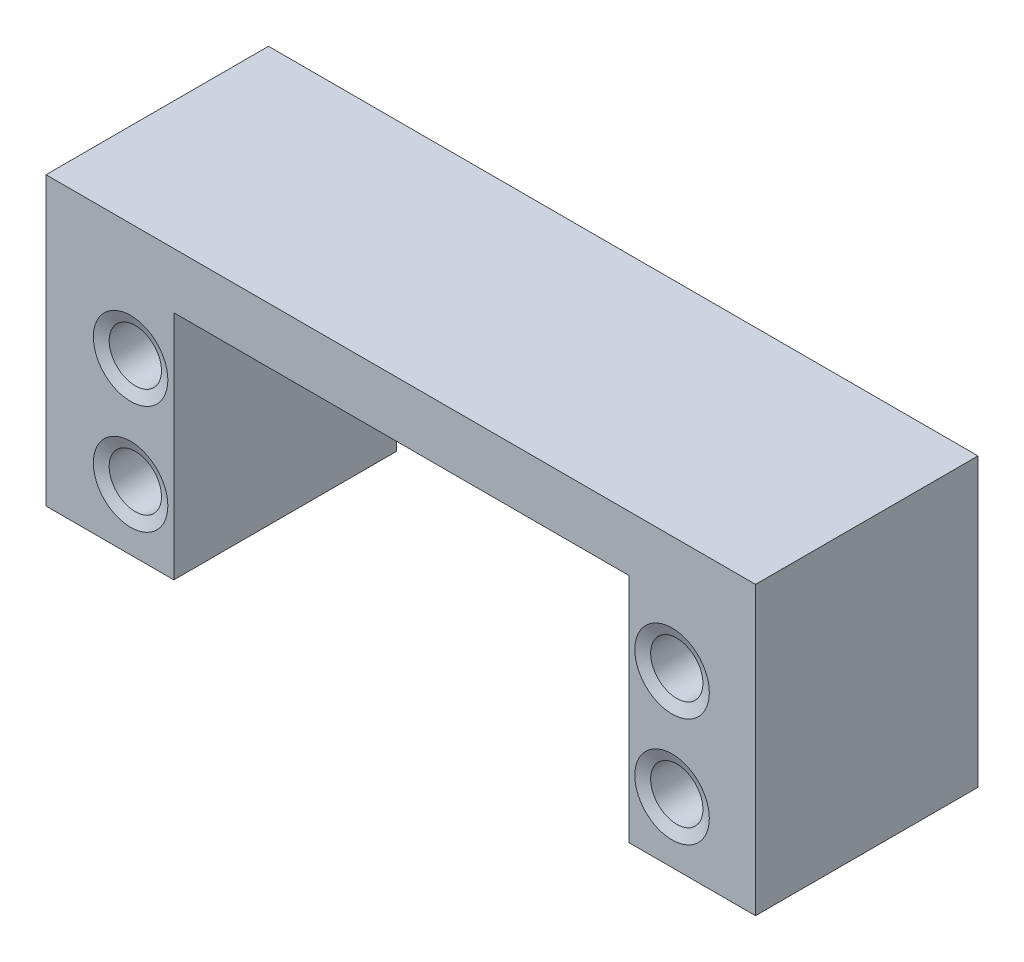
ISO-10303-21;
HEADER;
FILE_DESCRIPTION(('STEP AP214'),'2;1');
FILE_NAME('part.step','',(''),(''),'','','');
FILE_SCHEMA(('AUTOMOTIVE_DESIGN { 1 0 10303 214 1 1 1 1 }'));
ENDSEC;
DATA;
#1=APPLICATION_CONTEXT('core data for automotive mechanical design processes');
#2=APPLICATION_PROTOCOL_DEFINITION('international standard','automotive_design',2000,#1);
#3=PRODUCT_CONTEXT('',#1,'mechanical');
#4=PRODUCT('Part','Part','',(#3));
#5=PRODUCT_RELATED_PRODUCT_CATEGORY('part','',(#4));
#6=PRODUCT_DEFINITION_FORMATION('','',#4);
#7=PRODUCT_DEFINITION_CONTEXT('part definition',#1,'design');
#8=PRODUCT_DEFINITION('design','',#6,#7);
#9=PRODUCT_DEFINITION_SHAPE('','',#8);
#10=(LENGTH_UNIT() NAMED_UNIT(*) SI_UNIT(.MILLI.,.METRE.));
#11=(NAMED_UNIT(*) PLANE_ANGLE_UNIT() SI_UNIT($,.RADIAN.));
#12=(NAMED_UNIT(*) SI_UNIT($,.STERADIAN.) SOLID_ANGLE_UNIT());
#13=UNCERTAINTY_MEASURE_WITH_UNIT(LENGTH_MEASURE(1.E-05),#10,'distance_accuracy_value','');
#14=(GEOMETRIC_REPRESENTATION_CONTEXT(3) GLOBAL_UNCERTAINTY_ASSIGNED_CONTEXT((#13)) GLOBAL_UNIT_ASSIGNED_CONTEXT((#10,
#11,#12)) REPRESENTATION_CONTEXT('',''));
#15=CARTESIAN_POINT('',(0.,0.,0.));
#16=DIRECTION('',(0.,0.,1.));
#17=DIRECTION('',(1.,0.,0.));
#18=AXIS2_PLACEMENT_3D('',#15,#16,#17);
#19=CARTESIAN_POINT('',(0.,0.,20.));
#20=DIRECTION('',(0.,0.,1.));
#21=DIRECTION('',(1.,0.,0.));
#22=AXIS2_PLACEMENT_3D('',#19,#20,#21);
#23=PLANE('',#22);
#24=CARTESIAN_POINT('',(14.89,-4.9,20.));
#25=DIRECTION('',(0.,0.,1.));
#26=DIRECTION('',(1.,0.,0.));
#27=AXIS2_PLACEMENT_3D('',#24,#25,#26);
#28=CIRCLE('',#27,3.35000000000002);
#29=CARTESIAN_POINT('',(18.24,-4.9,20.));
#30=VERTEX_POINT('',#29);
#31=EDGE_CURVE('E233',#30,#30,#28,.F.);
#32=ORIENTED_EDGE('',*,*,#31,.T.);
#33=EDGE_LOOP('',(#32));
#34=FACE_BOUND('',#33,.T.);
#35=CARTESIAN_POINT('',(14.89,4.9,20.));
#36=DIRECTION('',(0.,0.,1.));
#37=DIRECTION('',(1.,0.,0.));
#38=AXIS2_PLACEMENT_3D('',#35,#36,#37);
#39=CIRCLE('',#38,3.35000000000001);
#40=CARTESIAN_POINT('',(18.24,4.9,20.));
#41=VERTEX_POINT('',#40);
#42=EDGE_CURVE('E229',#41,#41,#39,.F.);
#43=ORIENTED_EDGE('',*,*,#42,.T.);
#44=EDGE_LOOP('',(#43));
#45=FACE_BOUND('',#44,.T.);
#46=CARTESIAN_POINT('',(-33.79,4.9,20.));
#47=DIRECTION('',(0.,0.,1.));
#48=DIRECTION('',(1.,0.,0.));
#49=AXIS2_PLACEMENT_3D('',#46,#47,#48);
#50=CIRCLE('',#49,3.35000000000001);
#51=CARTESIAN_POINT('',(-30.44,4.9,20.));
#52=VERTEX_POINT('',#51);
#53=EDGE_CURVE('E225',#52,#52,#50,.F.);
#54=ORIENTED_EDGE('',*,*,#53,.T.);
#55=EDGE_LOOP('',(#54));
#56=FACE_BOUND('',#55,.T.);
#57=CARTESIAN_POINT('',(-33.79,-4.9,20.));
#58=DIRECTION('',(0.,0.,1.));
#59=DIRECTION('',(1.,0.,0.));
#60=AXIS2_PLACEMENT_3D('',#57,#58,#59);
#61=CIRCLE('',#60,3.35000000000002);
#62=CARTESIAN_POINT('',(-30.44,-4.9,20.));
#63=VERTEX_POINT('',#62);
#64=EDGE_CURVE('E221',#63,#63,#61,.F.);
#65=ORIENTED_EDGE('',*,*,#64,.T.);
#66=EDGE_LOOP('',(#65));
#67=FACE_BOUND('',#66,.T.);
#68=DIRECTION('',(-1.,0.,0.));
#69=VECTOR('',#68,1.);
#70=CARTESIAN_POINT('',(48.395,-10.4,20.));
#71=LINE('',#70,#69);
#72=CARTESIAN_POINT('',(22.395,-10.4,20.));
#73=VERTEX_POINT('',#72);
#74=CARTESIAN_POINT('',(11.,-10.4,20.));
#75=VERTEX_POINT('',#74);
#76=EDGE_CURVE('E167',#73,#75,#71,.T.);
#77=ORIENTED_EDGE('',*,*,#76,.F.);
#78=DIRECTION('',(0.,-1.,0.));
#79=VECTOR('',#78,1.);
#80=CARTESIAN_POINT('',(22.395,15.4,20.));
#81=LINE('',#80,#79);
#82=CARTESIAN_POINT('',(22.395,15.4,20.));
#83=VERTEX_POINT('',#82);
#84=EDGE_CURVE('E88',#83,#73,#81,.T.);
#85=ORIENTED_EDGE('',*,*,#84,.F.);
#86=DIRECTION('',(1.,0.,0.));
#87=VECTOR('',#86,1.);
#88=CARTESIAN_POINT('',(-58.395,15.4,20.));
#89=LINE('',#88,#87);
#90=CARTESIAN_POINT('',(-41.395,15.4,20.));
#91=VERTEX_POINT('',#90);
#92=EDGE_CURVE('E182',#91,#83,#89,.T.);
#93=ORIENTED_EDGE('',*,*,#92,.F.);
#94=DIRECTION('',(0.,1.,0.));
#95=VECTOR('',#94,1.);
#96=CARTESIAN_POINT('',(-41.395,-10.4,20.));
#97=LINE('',#96,#95);
#98=CARTESIAN_POINT('',(-41.395,-10.4,20.));
#99=VERTEX_POINT('',#98);
#100=EDGE_CURVE('E96',#99,#91,#97,.T.);
#101=ORIENTED_EDGE('',*,*,#100,.F.);
#102=DIRECTION('',(-1.,0.,0.));
#103=VECTOR('',#102,1.);
#104=CARTESIAN_POINT('',(-48.395,-10.4,20.));
#105=LINE('',#104,#103);
#106=CARTESIAN_POINT('',(-29.9,-10.4,20.));
#107=VERTEX_POINT('',#106);
#108=EDGE_CURVE('E200',#107,#99,#105,.T.);
#109=ORIENTED_EDGE('',*,*,#108,.F.);
#110=DIRECTION('',(0.,1.,0.));
#111=VECTOR('',#110,1.);
#112=CARTESIAN_POINT('',(-29.9,-10.4,20.));
#113=LINE('',#112,#111);
#114=CARTESIAN_POINT('',(-29.9,10.4,20.));
#115=VERTEX_POINT('',#114);
#116=EDGE_CURVE('E209',#107,#115,#113,.T.);
#117=ORIENTED_EDGE('',*,*,#116,.T.);
#118=DIRECTION('',(1.,0.,0.));
#119=VECTOR('',#118,1.);
#120=CARTESIAN_POINT('',(-58.395,10.4,20.));
#121=LINE('',#120,#119);
#122=CARTESIAN_POINT('',(11.,10.4,20.));
#123=VERTEX_POINT('',#122);
#124=EDGE_CURVE('E179',#115,#123,#121,.T.);
#125=ORIENTED_EDGE('',*,*,#124,.T.);
#126=DIRECTION('',(0.,-1.,0.));
#127=VECTOR('',#126,1.);
#128=CARTESIAN_POINT('',(11.,10.4,20.));
#129=LINE('',#128,#127);
#130=EDGE_CURVE('E173',#123,#75,#129,.T.);
#131=ORIENTED_EDGE('',*,*,#130,.T.);
#132=EDGE_LOOP('',(#77,#85,#93,#101,#109,#117,#125,#131));
#133=FACE_BOUND('',#132,.T.);
#134=ADVANCED_FACE('F71',(#34,#45,#56,#67,#133),#23,.T.);
#135=CARTESIAN_POINT('',(0.,0.,0.));
#136=DIRECTION('',(0.,0.,1.));
#137=DIRECTION('',(1.,0.,0.));
#138=AXIS2_PLACEMENT_3D('',#135,#136,#137);
#139=PLANE('',#138);
#140=DIRECTION('',(0.,1.,0.));
#141=VECTOR('',#140,1.);
#142=CARTESIAN_POINT('',(22.395,-10.4,0.));
#143=LINE('',#142,#141);
#144=CARTESIAN_POINT('',(22.395,-10.4,0.));
#145=VERTEX_POINT('',#144);
#146=CARTESIAN_POINT('',(22.395,15.4,0.));
#147=VERTEX_POINT('',#146);
#148=EDGE_CURVE('E139',#145,#147,#143,.T.);
#149=ORIENTED_EDGE('',*,*,#148,.F.);
#150=DIRECTION('',(-1.,0.,0.));
#151=VECTOR('',#150,1.);
#152=CARTESIAN_POINT('',(48.395,-10.4,0.));
#153=LINE('',#152,#151);
#154=CARTESIAN_POINT('',(11.,-10.4,0.));
#155=VERTEX_POINT('',#154);
#156=EDGE_CURVE('E150',#145,#155,#153,.T.);
#157=ORIENTED_EDGE('',*,*,#156,.T.);
#158=DIRECTION('',(0.,-1.,0.));
#159=VECTOR('',#158,1.);
#160=CARTESIAN_POINT('',(11.,10.4,0.));
#161=LINE('',#160,#159);
#162=CARTESIAN_POINT('',(11.,10.4,0.));
#163=VERTEX_POINT('',#162);
#164=EDGE_CURVE('E162',#163,#155,#161,.T.);
#165=ORIENTED_EDGE('',*,*,#164,.F.);
#166=DIRECTION('',(-1.,0.,0.));
#167=VECTOR('',#166,1.);
#168=CARTESIAN_POINT('',(-58.395,10.4,0.));
#169=LINE('',#168,#167);
#170=CARTESIAN_POINT('',(-29.9,10.4,0.));
#171=VERTEX_POINT('',#170);
#172=EDGE_CURVE('E186',#163,#171,#169,.T.);
#173=ORIENTED_EDGE('',*,*,#172,.T.);
#174=DIRECTION('',(0.,1.,0.));
#175=VECTOR('',#174,1.);
#176=CARTESIAN_POINT('',(-29.9,-10.4,0.));
#177=LINE('',#176,#175);
#178=CARTESIAN_POINT('',(-29.9,-10.4,0.));
#179=VERTEX_POINT('',#178);
#180=EDGE_CURVE('E204',#179,#171,#177,.T.);
#181=ORIENTED_EDGE('',*,*,#180,.F.);
#182=DIRECTION('',(-1.,0.,0.));
#183=VECTOR('',#182,1.);
#184=CARTESIAN_POINT('',(-48.395,-10.4,0.));
#185=LINE('',#184,#183);
#186=CARTESIAN_POINT('',(-41.395,-10.4,0.));
#187=VERTEX_POINT('',#186);
#188=EDGE_CURVE('E195',#179,#187,#185,.T.);
#189=ORIENTED_EDGE('',*,*,#188,.T.);
#190=DIRECTION('',(0.,-1.,0.));
#191=VECTOR('',#190,1.);
#192=CARTESIAN_POINT('',(-41.395,15.4,0.));
#193=LINE('',#192,#191);
#194=CARTESIAN_POINT('',(-41.395,15.4,0.));
#195=VERTEX_POINT('',#194);
#196=EDGE_CURVE('E340',#195,#187,#193,.T.);
#197=ORIENTED_EDGE('',*,*,#196,.F.);
#198=DIRECTION('',(-1.,0.,0.));
#199=VECTOR('',#198,1.);
#200=CARTESIAN_POINT('',(-58.395,15.4,0.));
#201=LINE('',#200,#199);
#202=EDGE_CURVE('E153',#147,#195,#201,.T.);
#203=ORIENTED_EDGE('',*,*,#202,.F.);
#204=EDGE_LOOP('',(#149,#157,#165,#173,#181,#189,#197,#203));
#205=FACE_BOUND('',#204,.T.);
#206=ADVANCED_FACE('F148',(#205),#139,.F.);
#207=CARTESIAN_POINT('',(0.,15.4,0.));
#208=DIRECTION('',(0.,1.,0.));
#209=DIRECTION('',(-1.,0.,0.));
#210=AXIS2_PLACEMENT_3D('',#207,#208,#209);
#211=PLANE('',#210);
#212=ORIENTED_EDGE('',*,*,#92,.T.);
#213=DIRECTION('',(0.,0.,1.));
#214=VECTOR('',#213,1.);
#215=CARTESIAN_POINT('',(22.395,15.4,0.));
#216=LINE('',#215,#214);
#217=EDGE_CURVE('E155',#147,#83,#216,.T.);
#218=ORIENTED_EDGE('',*,*,#217,.F.);
#219=ORIENTED_EDGE('',*,*,#202,.T.);
#220=DIRECTION('',(0.,0.,-1.));
#221=VECTOR('',#220,1.);
#222=CARTESIAN_POINT('',(-41.395,15.4,20.));
#223=LINE('',#222,#221);
#224=EDGE_CURVE('E369',#91,#195,#223,.T.);
#225=ORIENTED_EDGE('',*,*,#224,.F.);
#226=EDGE_LOOP('',(#212,#218,#219,#225));
#227=FACE_BOUND('',#226,.T.);
#228=ADVANCED_FACE('F269',(#227),#211,.T.);
#229=CARTESIAN_POINT('',(48.395,-10.4,20.));
#230=DIRECTION('',(0.,-1.,0.));
#231=DIRECTION('',(1.,0.,0.));
#232=AXIS2_PLACEMENT_3D('',#229,#230,#231);
#233=PLANE('',#232);
#234=ORIENTED_EDGE('',*,*,#156,.F.);
#235=DIRECTION('',(0.,0.,-1.));
#236=VECTOR('',#235,1.);
#237=CARTESIAN_POINT('',(22.395,-10.4,20.));
#238=LINE('',#237,#236);
#239=EDGE_CURVE('E136',#73,#145,#238,.T.);
#240=ORIENTED_EDGE('',*,*,#239,.F.);
#241=ORIENTED_EDGE('',*,*,#76,.T.);
#242=DIRECTION('',(0.,0.,-1.));
#243=VECTOR('',#242,1.);
#244=CARTESIAN_POINT('',(11.,-10.4,20.));
#245=LINE('',#244,#243);
#246=EDGE_CURVE('E159',#75,#155,#245,.T.);
#247=ORIENTED_EDGE('',*,*,#246,.T.);
#248=EDGE_LOOP('',(#234,#240,#241,#247));
#249=FACE_BOUND('',#248,.T.);
#250=ADVANCED_FACE('F157',(#249),#233,.T.);
#251=CARTESIAN_POINT('',(-48.395,-10.4,20.));
#252=DIRECTION('',(0.,1.,0.));
#253=DIRECTION('',(0.,0.,1.));
#254=AXIS2_PLACEMENT_3D('',#251,#252,#253);
#255=PLANE('',#254);
#256=DIRECTION('',(0.,0.,1.));
#257=VECTOR('',#256,1.);
#258=CARTESIAN_POINT('',(-41.395,-10.4,0.));
#259=LINE('',#258,#257);
#260=EDGE_CURVE('E337',#187,#99,#259,.T.);
#261=ORIENTED_EDGE('',*,*,#260,.F.);
#262=ORIENTED_EDGE('',*,*,#188,.F.);
#263=DIRECTION('',(0.,0.,-1.));
#264=VECTOR('',#263,1.);
#265=CARTESIAN_POINT('',(-29.9,-10.4,20.));
#266=LINE('',#265,#264);
#267=EDGE_CURVE('E189',#107,#179,#266,.T.);
#268=ORIENTED_EDGE('',*,*,#267,.F.);
#269=ORIENTED_EDGE('',*,*,#108,.T.);
#270=EDGE_LOOP('',(#261,#262,#268,#269));
#271=FACE_BOUND('',#270,.T.);
#272=ADVANCED_FACE('F320',(#271),#255,.F.);
#273=CARTESIAN_POINT('',(0.,10.4,0.));
#274=DIRECTION('',(0.,1.,0.));
#275=DIRECTION('',(-1.,0.,0.));
#276=AXIS2_PLACEMENT_3D('',#273,#274,#275);
#277=PLANE('',#276);
#278=DIRECTION('',(0.,0.,-1.));
#279=VECTOR('',#278,1.);
#280=CARTESIAN_POINT('',(11.,10.4,20.));
#281=LINE('',#280,#279);
#282=EDGE_CURVE('E176',#123,#163,#281,.T.);
#283=ORIENTED_EDGE('',*,*,#282,.F.);
#284=ORIENTED_EDGE('',*,*,#124,.F.);
#285=DIRECTION('',(0.,0.,-1.));
#286=VECTOR('',#285,1.);
#287=CARTESIAN_POINT('',(-29.9,10.4,20.));
#288=LINE('',#287,#286);
#289=EDGE_CURVE('E205',#115,#171,#288,.T.);
#290=ORIENTED_EDGE('',*,*,#289,.T.);
#291=ORIENTED_EDGE('',*,*,#172,.F.);
#292=EDGE_LOOP('',(#283,#284,#290,#291));
#293=FACE_BOUND('',#292,.T.);
#294=ADVANCED_FACE('F324',(#293),#277,.F.);
#295=CARTESIAN_POINT('',(-29.9,-10.4,20.));
#296=DIRECTION('',(-1.,0.,0.));
#297=DIRECTION('',(0.,0.,1.));
#298=AXIS2_PLACEMENT_3D('',#295,#296,#297);
#299=PLANE('',#298);
#300=ORIENTED_EDGE('',*,*,#180,.T.);
#301=ORIENTED_EDGE('',*,*,#289,.F.);
#302=ORIENTED_EDGE('',*,*,#116,.F.);
#303=ORIENTED_EDGE('',*,*,#267,.T.);
#304=EDGE_LOOP('',(#300,#301,#302,#303));
#305=FACE_BOUND('',#304,.T.);
#306=ADVANCED_FACE('F316',(#305),#299,.F.);
#307=CARTESIAN_POINT('',(11.,10.4,20.));
#308=DIRECTION('',(1.,0.,0.));
#309=DIRECTION('',(0.,0.,-1.));
#310=AXIS2_PLACEMENT_3D('',#307,#308,#309);
#311=PLANE('',#310);
#312=ORIENTED_EDGE('',*,*,#164,.T.);
#313=ORIENTED_EDGE('',*,*,#246,.F.);
#314=ORIENTED_EDGE('',*,*,#130,.F.);
#315=ORIENTED_EDGE('',*,*,#282,.T.);
#316=EDGE_LOOP('',(#312,#313,#314,#315));
#317=FACE_BOUND('',#316,.T.);
#318=ADVANCED_FACE('F298',(#317),#311,.F.);
#319=CARTESIAN_POINT('',(14.89,-4.9,10.));
#320=DIRECTION('',(0.,0.,1.));
#321=DIRECTION('',(1.,0.,0.));
#322=AXIS2_PLACEMENT_3D('',#319,#320,#321);
#323=CYLINDRICAL_SURFACE('',#322,2.35);
#324=CARTESIAN_POINT('',(14.89,-4.9,19.5755251837904));
#325=DIRECTION('',(0.,0.,1.));
#326=DIRECTION('',(1.,0.,0.));
#327=AXIS2_PLACEMENT_3D('',#324,#325,#326);
#328=CIRCLE('',#327,2.35);
#329=CARTESIAN_POINT('',(17.24,-4.9,19.5755251837904));
#330=VERTEX_POINT('',#329);
#331=EDGE_CURVE('E199',#330,#330,#328,.T.);
#332=ORIENTED_EDGE('',*,*,#331,.T.);
#333=EDGE_LOOP('',(#332));
#334=FACE_BOUND('',#333,.T.);
#335=CARTESIAN_POINT('',(14.89,-4.9,10.));
#336=DIRECTION('',(0.,0.,1.));
#337=DIRECTION('',(1.,0.,0.));
#338=AXIS2_PLACEMENT_3D('',#335,#336,#337);
#339=CIRCLE('',#338,2.35);
#340=CARTESIAN_POINT('',(17.24,-4.9,10.));
#341=VERTEX_POINT('',#340);
#342=EDGE_CURVE('E163',#341,#341,#339,.T.);
#343=ORIENTED_EDGE('',*,*,#342,.F.);
#344=EDGE_LOOP('',(#343));
#345=FACE_BOUND('',#344,.T.);
#346=ADVANCED_FACE('F295',(#334,#345),#323,.F.);
#347=CARTESIAN_POINT('',(14.89,-4.9,10.));
#348=DIRECTION('',(0.,0.,1.));
#349=DIRECTION('',(1.,0.,0.));
#350=AXIS2_PLACEMENT_3D('',#347,#348,#349);
#351=PLANE('',#350);
#352=ORIENTED_EDGE('',*,*,#342,.T.);
#353=EDGE_LOOP('',(#352));
#354=FACE_BOUND('',#353,.T.);
#355=ADVANCED_FACE('F297',(#354),#351,.T.);
#356=CARTESIAN_POINT('',(-33.79,4.9,10.));
#357=DIRECTION('',(0.,0.,1.));
#358=DIRECTION('',(1.,0.,0.));
#359=AXIS2_PLACEMENT_3D('',#356,#357,#358);
#360=CYLINDRICAL_SURFACE('',#359,2.35);
#361=CARTESIAN_POINT('',(-33.79,4.9,19.5755251837904));
#362=DIRECTION('',(0.,0.,1.));
#363=DIRECTION('',(1.,0.,0.));
#364=AXIS2_PLACEMENT_3D('',#361,#362,#363);
#365=CIRCLE('',#364,2.35);
#366=CARTESIAN_POINT('',(-31.44,4.9,19.5755251837904));
#367=VERTEX_POINT('',#366);
#368=EDGE_CURVE('E81',#367,#367,#365,.T.);
#369=ORIENTED_EDGE('',*,*,#368,.T.);
#370=EDGE_LOOP('',(#369));
#371=FACE_BOUND('',#370,.T.);
#372=CARTESIAN_POINT('',(-33.79,4.9,10.));
#373=DIRECTION('',(0.,0.,1.));
#374=DIRECTION('',(1.,0.,0.));
#375=AXIS2_PLACEMENT_3D('',#372,#373,#374);
#376=CIRCLE('',#375,2.35);
#377=CARTESIAN_POINT('',(-31.44,4.9,10.));
#378=VERTEX_POINT('',#377);
#379=EDGE_CURVE('E352',#378,#378,#376,.T.);
#380=ORIENTED_EDGE('',*,*,#379,.F.);
#381=EDGE_LOOP('',(#380));
#382=FACE_BOUND('',#381,.T.);
#383=ADVANCED_FACE('F244',(#371,#382),#360,.F.);
#384=CARTESIAN_POINT('',(-33.79,4.9,10.));
#385=DIRECTION('',(0.,0.,1.));
#386=DIRECTION('',(1.,0.,0.));
#387=AXIS2_PLACEMENT_3D('',#384,#385,#386);
#388=PLANE('',#387);
#389=ORIENTED_EDGE('',*,*,#379,.T.);
#390=EDGE_LOOP('',(#389));
#391=FACE_BOUND('',#390,.T.);
#392=ADVANCED_FACE('F309',(#391),#388,.T.);
#393=CARTESIAN_POINT('',(-33.79,-4.9,10.));
#394=DIRECTION('',(0.,0.,1.));
#395=DIRECTION('',(1.,0.,0.));
#396=AXIS2_PLACEMENT_3D('',#393,#394,#395);
#397=CYLINDRICAL_SURFACE('',#396,2.35);
#398=CARTESIAN_POINT('',(-33.79,-4.9,19.5755251837904));
#399=DIRECTION('',(0.,0.,1.));
#400=DIRECTION('',(1.,0.,0.));
#401=AXIS2_PLACEMENT_3D('',#398,#399,#400);
#402=CIRCLE('',#401,2.35);
#403=CARTESIAN_POINT('',(-31.44,-4.9,19.5755251837904));
#404=VERTEX_POINT('',#403);
#405=EDGE_CURVE('E12',#404,#404,#402,.T.);
#406=ORIENTED_EDGE('',*,*,#405,.T.);
#407=EDGE_LOOP('',(#406));
#408=FACE_BOUND('',#407,.T.);
#409=CARTESIAN_POINT('',(-33.79,-4.9,10.));
#410=DIRECTION('',(0.,0.,1.));
#411=DIRECTION('',(-1.,0.,0.));
#412=AXIS2_PLACEMENT_3D('',#409,#410,#411);
#413=CIRCLE('',#412,2.35);
#414=CARTESIAN_POINT('',(-36.14,-4.9,10.));
#415=VERTEX_POINT('',#414);
#416=EDGE_CURVE('E356',#415,#415,#413,.T.);
#417=ORIENTED_EDGE('',*,*,#416,.F.);
#418=EDGE_LOOP('',(#417));
#419=FACE_BOUND('',#418,.T.);
#420=ADVANCED_FACE('F312',(#408,#419),#397,.F.);
#421=CARTESIAN_POINT('',(-33.79,-4.9,10.));
#422=DIRECTION('',(0.,0.,-1.));
#423=DIRECTION('',(-1.,0.,0.));
#424=AXIS2_PLACEMENT_3D('',#421,#422,#423);
#425=PLANE('',#424);
#426=ORIENTED_EDGE('',*,*,#416,.T.);
#427=EDGE_LOOP('',(#426));
#428=FACE_BOUND('',#427,.T.);
#429=ADVANCED_FACE('F385',(#428),#425,.F.);
#430=CARTESIAN_POINT('',(14.89,4.9,10.));
#431=DIRECTION('',(0.,0.,1.));
#432=DIRECTION('',(1.,0.,0.));
#433=AXIS2_PLACEMENT_3D('',#430,#431,#432);
#434=CYLINDRICAL_SURFACE('',#433,2.35);
#435=CARTESIAN_POINT('',(14.89,4.9,19.5755251837904));
#436=DIRECTION('',(0.,0.,1.));
#437=DIRECTION('',(1.,0.,0.));
#438=AXIS2_PLACEMENT_3D('',#435,#436,#437);
#439=CIRCLE('',#438,2.35);
#440=CARTESIAN_POINT('',(17.24,4.9,19.5755251837904));
#441=VERTEX_POINT('',#440);
#442=EDGE_CURVE('E237',#441,#441,#439,.T.);
#443=ORIENTED_EDGE('',*,*,#442,.T.);
#444=EDGE_LOOP('',(#443));
#445=FACE_BOUND('',#444,.T.);
#446=CARTESIAN_POINT('',(14.89,4.9,10.));
#447=DIRECTION('',(0.,0.,1.));
#448=DIRECTION('',(-1.,0.,0.));
#449=AXIS2_PLACEMENT_3D('',#446,#447,#448);
#450=CIRCLE('',#449,2.35);
#451=CARTESIAN_POINT('',(12.54,4.9,10.));
#452=VERTEX_POINT('',#451);
#453=EDGE_CURVE('E170',#452,#452,#450,.T.);
#454=ORIENTED_EDGE('',*,*,#453,.F.);
#455=EDGE_LOOP('',(#454));
#456=FACE_BOUND('',#455,.T.);
#457=ADVANCED_FACE('F379',(#445,#456),#434,.F.);
#458=CARTESIAN_POINT('',(14.89,4.9,10.));
#459=DIRECTION('',(0.,0.,-1.));
#460=DIRECTION('',(-1.,0.,0.));
#461=AXIS2_PLACEMENT_3D('',#458,#459,#460);
#462=PLANE('',#461);
#463=ORIENTED_EDGE('',*,*,#453,.T.);
#464=EDGE_LOOP('',(#463));
#465=FACE_BOUND('',#464,.T.);
#466=ADVANCED_FACE('F375',(#465),#462,.F.);
#467=CARTESIAN_POINT('',(-41.395,0.,0.));
#468=DIRECTION('',(-1.,0.,0.));
#469=DIRECTION('',(0.,0.,1.));
#470=AXIS2_PLACEMENT_3D('',#467,#468,#469);
#471=PLANE('',#470);
#472=ORIENTED_EDGE('',*,*,#224,.T.);
#473=ORIENTED_EDGE('',*,*,#196,.T.);
#474=ORIENTED_EDGE('',*,*,#260,.T.);
#475=ORIENTED_EDGE('',*,*,#100,.T.);
#476=EDGE_LOOP('',(#472,#473,#474,#475));
#477=FACE_BOUND('',#476,.T.);
#478=ADVANCED_FACE('F289',(#477),#471,.T.);
#479=CARTESIAN_POINT('',(22.395,0.,0.));
#480=DIRECTION('',(1.,0.,0.));
#481=DIRECTION('',(0.,0.,-1.));
#482=AXIS2_PLACEMENT_3D('',#479,#480,#481);
#483=PLANE('',#482);
#484=ORIENTED_EDGE('',*,*,#84,.T.);
#485=ORIENTED_EDGE('',*,*,#239,.T.);
#486=ORIENTED_EDGE('',*,*,#148,.T.);
#487=ORIENTED_EDGE('',*,*,#217,.T.);
#488=EDGE_LOOP('',(#484,#485,#486,#487));
#489=FACE_BOUND('',#488,.T.);
#490=ADVANCED_FACE('F138',(#489),#483,.T.);
#491=CARTESIAN_POINT('',(14.89,-4.9,19.5755251837904));
#492=DIRECTION('',(0.,0.,1.));
#493=DIRECTION('',(1.,0.,0.));
#494=AXIS2_PLACEMENT_3D('',#491,#492,#493);
#495=CONICAL_SURFACE('',#494,2.35,1.16937059883621);
#496=CARTESIAN_POINT('',(18.24,-4.9,20.));
#497=CARTESIAN_POINT('',(18.2295833333334,-4.9,19.9955783873312));
#498=CARTESIAN_POINT('',(18.2191666666667,-4.9,19.9911567746623));
#499=CARTESIAN_POINT('',(18.1983333333334,-4.9,19.9823135493246));
#500=CARTESIAN_POINT('',(18.1879166666667,-4.9,19.9778919366558));
#501=CARTESIAN_POINT('',(18.1670833333334,-4.9,19.969048711318));
#502=CARTESIAN_POINT('',(18.1566666666667,-4.9,19.9646270986492));
#503=CARTESIAN_POINT('',(18.1358333333334,-4.9,19.9557838733115));
#504=CARTESIAN_POINT('',(18.1254166666667,-4.9,19.9513622606427));
#505=CARTESIAN_POINT('',(18.1045833333334,-4.9,19.9425190353049));
#506=CARTESIAN_POINT('',(18.0941666666667,-4.9,19.9380974226361));
#507=CARTESIAN_POINT('',(18.0733333333334,-4.9,19.9292541972984));
#508=CARTESIAN_POINT('',(18.0629166666667,-4.9,19.9248325846295));
#509=CARTESIAN_POINT('',(18.0420833333334,-4.9,19.9159893592918));
#510=CARTESIAN_POINT('',(18.0316666666667,-4.9,19.911567746623));
#511=CARTESIAN_POINT('',(18.0108333333333,-4.9,19.9027245212853));
#512=CARTESIAN_POINT('',(18.0004166666667,-4.9,19.8983029086165));
#513=CARTESIAN_POINT('',(17.9795833333333,-4.9,19.8894596832787));
#514=CARTESIAN_POINT('',(17.9691666666667,-4.9,19.8850380706099));
#515=CARTESIAN_POINT('',(17.9483333333333,-4.9,19.8761948452722));
#516=CARTESIAN_POINT('',(17.9379166666667,-4.9,19.8717732326033));
#517=CARTESIAN_POINT('',(17.9170833333333,-4.9,19.8629300072656));
#518=CARTESIAN_POINT('',(17.9066666666667,-4.9,19.8585083945968));
#519=CARTESIAN_POINT('',(17.8858333333333,-4.9,19.8496651692591));
#520=CARTESIAN_POINT('',(17.8754166666667,-4.9,19.8452435565902));
#521=CARTESIAN_POINT('',(17.8545833333333,-4.9,19.8364003312525));
#522=CARTESIAN_POINT('',(17.8441666666667,-4.9,19.8319787185837));
#523=CARTESIAN_POINT('',(17.8233333333333,-4.9,19.823135493246));
#524=CARTESIAN_POINT('',(17.8129166666667,-4.9,19.8187138805771));
#525=CARTESIAN_POINT('',(17.7920833333333,-4.9,19.8098706552394));
#526=CARTESIAN_POINT('',(17.7816666666667,-4.9,19.8054490425706));
#527=CARTESIAN_POINT('',(17.7608333333333,-4.9,19.7966058172329));
#528=CARTESIAN_POINT('',(17.7504166666667,-4.9,19.792184204564));
#529=CARTESIAN_POINT('',(17.7295833333333,-4.9,19.7833409792263));
#530=CARTESIAN_POINT('',(17.7191666666667,-4.9,19.7789193665575));
#531=CARTESIAN_POINT('',(17.6983333333333,-4.9,19.7700761412198));
#532=CARTESIAN_POINT('',(17.6879166666667,-4.9,19.7656545285509));
#533=CARTESIAN_POINT('',(17.6670833333333,-4.9,19.7568113032132));
#534=CARTESIAN_POINT('',(17.6566666666667,-4.9,19.7523896905444));
#535=CARTESIAN_POINT('',(17.6358333333333,-4.9,19.7435464652067));
#536=CARTESIAN_POINT('',(17.6254166666667,-4.9,19.7391248525378));
#537=CARTESIAN_POINT('',(17.6045833333333,-4.9,19.7302816272001));
#538=CARTESIAN_POINT('',(17.5941666666667,-4.9,19.7258600145313));
#539=CARTESIAN_POINT('',(17.5733333333333,-4.9,19.7170167891936));
#540=CARTESIAN_POINT('',(17.5629166666667,-4.9,19.7125951765247));
#541=CARTESIAN_POINT('',(17.5420833333333,-4.9,19.703751951187));
#542=CARTESIAN_POINT('',(17.5316666666667,-4.9,19.6993303385182));
#543=CARTESIAN_POINT('',(17.5108333333333,-4.9,19.6904871131805));
#544=CARTESIAN_POINT('',(17.5004166666667,-4.9,19.6860655005116));
#545=CARTESIAN_POINT('',(17.4795833333333,-4.9,19.6772222751739));
#546=CARTESIAN_POINT('',(17.4691666666667,-4.9,19.6728006625051));
#547=CARTESIAN_POINT('',(17.4483333333333,-4.9,19.6639574371674));
#548=CARTESIAN_POINT('',(17.4379166666667,-4.9,19.6595358244985));
#549=CARTESIAN_POINT('',(17.4170833333333,-4.9,19.6506925991608));
#550=CARTESIAN_POINT('',(17.4066666666667,-4.9,19.646270986492));
#551=CARTESIAN_POINT('',(17.3858333333333,-4.9,19.6374277611543));
#552=CARTESIAN_POINT('',(17.3754166666667,-4.9,19.6330061484854));
#553=CARTESIAN_POINT('',(17.3545833333333,-4.9,19.6241629231477));
#554=CARTESIAN_POINT('',(17.3441666666667,-4.9,19.6197413104789));
#555=CARTESIAN_POINT('',(17.3233333333333,-4.9,19.6108980851412));
#556=CARTESIAN_POINT('',(17.3129166666667,-4.9,19.6064764724723));
#557=CARTESIAN_POINT('',(17.2920833333333,-4.9,19.5976332471346));
#558=CARTESIAN_POINT('',(17.2816666666667,-4.9,19.5932116344658));
#559=CARTESIAN_POINT('',(17.2608333333333,-4.9,19.5843684091281));
#560=CARTESIAN_POINT('',(17.2504166666667,-4.9,19.5799467964592));
#561=CARTESIAN_POINT('',(17.24,-4.9,19.5755251837904));
#562=B_SPLINE_CURVE_WITH_KNOTS('',3,(#496,#497,#498,#499,#500,#501,#502,#503,#504,#505,#506,
#507,#508,#509,#510,#511,#512,#513,#514,#515,#516,#517,#518,#519,#520,#521,#522,#523,#524,#525,
#526,#527,#528,#529,#530,#531,#532,#533,#534,#535,#536,#537,#538,#539,#540,#541,#542,#543,#544,
#545,#546,#547,#548,#549,#550,#551,#552,#553,#554,#555,#556,#557,#558,#559,#560,#561),
.UNSPECIFIED.,.F.,.F.,(4,2,2,2,2,2,2,2,2,2,2,2,2,2,2,2,2,2,2,2,2,2,2,2,2,2,2,2,2,2,2,2,4),(0.,
0.0339487617939163,0.0678975235878311,0.101846285381751,0.135795047175665,0.169743808969582,
0.203692570763497,0.237641332557413,0.271590094351331,0.305538856145247,0.339487617939162,
0.373436379733078,0.407385141526995,0.441333903320913,0.475282665114828,0.509231426908744,
0.543180188702659,0.577128950496575,0.611077712290493,0.645026474084409,0.678975235878324,
0.71292399767224,0.746872759466155,0.780821521260075,0.814770283053991,0.848719044847906,
0.882667806641822,0.916616568435737,0.950565330229656,0.984514092023571,1.01846285381749,
1.0524116156114,1.08636037740532),.UNSPECIFIED.);
#563=EDGE_CURVE('BSEAM256',#30,#330,#562,.T.);
#564=ORIENTED_EDGE('',*,*,#31,.F.);
#565=ORIENTED_EDGE('',*,*,#331,.F.);
#566=ORIENTED_EDGE('',*,*,#563,.T.);
#567=ORIENTED_EDGE('',*,*,#563,.F.);
#568=EDGE_LOOP('',(#564,#566,#565,#567));
#569=FACE_BOUND('',#568,.T.);
#570=ADVANCED_FACE('F256',(#569),#495,.F.);
#571=CARTESIAN_POINT('',(14.89,4.9,19.5755251837904));
#572=DIRECTION('',(0.,0.,1.));
#573=DIRECTION('',(1.,0.,0.));
#574=AXIS2_PLACEMENT_3D('',#571,#572,#573);
#575=CONICAL_SURFACE('',#574,2.35,1.1693705988362);
#576=ORIENTED_EDGE('',*,*,#42,.F.);
#577=EDGE_LOOP('',(#576));
#578=FACE_BOUND('',#577,.T.);
#579=ORIENTED_EDGE('',*,*,#442,.F.);
#580=EDGE_LOOP('',(#579));
#581=FACE_BOUND('',#580,.T.);
#582=ADVANCED_FACE('F249',(#578,#581),#575,.F.);
#583=CARTESIAN_POINT('',(-33.79,4.9,19.5755251837904));
#584=DIRECTION('',(0.,0.,1.));
#585=DIRECTION('',(1.,0.,0.));
#586=AXIS2_PLACEMENT_3D('',#583,#584,#585);
#587=CONICAL_SURFACE('',#586,2.35,1.1693705988362);
#588=ORIENTED_EDGE('',*,*,#53,.F.);
#589=EDGE_LOOP('',(#588));
#590=FACE_BOUND('',#589,.T.);
#591=ORIENTED_EDGE('',*,*,#368,.F.);
#592=EDGE_LOOP('',(#591));
#593=FACE_BOUND('',#592,.T.);
#594=ADVANCED_FACE('F247',(#590,#593),#587,.F.);
#595=CARTESIAN_POINT('',(-33.79,-4.9,19.5755251837904));
#596=DIRECTION('',(0.,0.,1.));
#597=DIRECTION('',(1.,0.,0.));
#598=AXIS2_PLACEMENT_3D('',#595,#596,#597);
#599=CONICAL_SURFACE('',#598,2.35,1.16937059883621);
#600=ORIENTED_EDGE('',*,*,#64,.F.);
#601=EDGE_LOOP('',(#600));
#602=FACE_BOUND('',#601,.T.);
#603=ORIENTED_EDGE('',*,*,#405,.F.);
#604=EDGE_LOOP('',(#603));
#605=FACE_BOUND('',#604,.T.);
#606=ADVANCED_FACE('F74',(#602,#605),#599,.F.);
#607=CLOSED_SHELL('',(#134,#206,#228,#250,#272,#294,#306,#318,#346,#355,#383,#392,#420,#429,
#457,#466,#478,#490,#570,#582,#594,#606));
#608=MANIFOLD_SOLID_BREP('B2',#607);
#609=ADVANCED_BREP_SHAPE_REPRESENTATION('',(#18,#608),#14);
#610=SHAPE_DEFINITION_REPRESENTATION(#9,#609);
ENDSEC;
END-ISO-10303-21;
